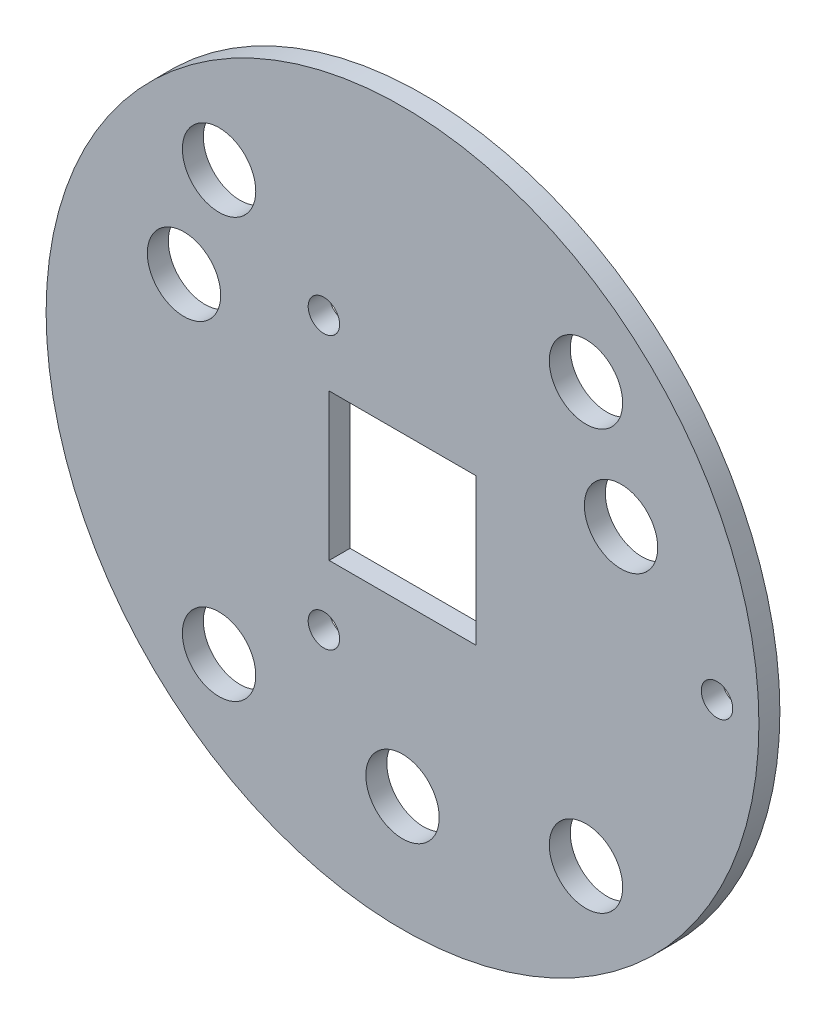
ISO-10303-21;
HEADER;
FILE_DESCRIPTION(('STEP AP214'),'2;1');
FILE_NAME('part.step','',(''),(''),'','','');
FILE_SCHEMA(('AUTOMOTIVE_DESIGN { 1 0 10303 214 1 1 1 1 }'));
ENDSEC;
DATA;
#1=APPLICATION_CONTEXT('core data for automotive mechanical design processes');
#2=APPLICATION_PROTOCOL_DEFINITION('international standard','automotive_design',2000,#1);
#3=PRODUCT_CONTEXT('',#1,'mechanical');
#4=PRODUCT('Part','Part','',(#3));
#5=PRODUCT_RELATED_PRODUCT_CATEGORY('part','',(#4));
#6=PRODUCT_DEFINITION_FORMATION('','',#4);
#7=PRODUCT_DEFINITION_CONTEXT('part definition',#1,'design');
#8=PRODUCT_DEFINITION('design','',#6,#7);
#9=PRODUCT_DEFINITION_SHAPE('','',#8);
#10=(LENGTH_UNIT() NAMED_UNIT(*) SI_UNIT(.MILLI.,.METRE.));
#11=(NAMED_UNIT(*) PLANE_ANGLE_UNIT() SI_UNIT($,.RADIAN.));
#12=(NAMED_UNIT(*) SI_UNIT($,.STERADIAN.) SOLID_ANGLE_UNIT());
#13=UNCERTAINTY_MEASURE_WITH_UNIT(LENGTH_MEASURE(1.E-05),#10,'distance_accuracy_value','');
#14=(GEOMETRIC_REPRESENTATION_CONTEXT(3) GLOBAL_UNCERTAINTY_ASSIGNED_CONTEXT((#13)) GLOBAL_UNIT_ASSIGNED_CONTEXT((#10,
#11,#12)) REPRESENTATION_CONTEXT('',''));
#15=CARTESIAN_POINT('',(0.,0.,0.));
#16=DIRECTION('',(0.,0.,1.));
#17=DIRECTION('',(1.,0.,0.));
#18=AXIS2_PLACEMENT_3D('',#15,#16,#17);
#19=CARTESIAN_POINT('',(0.,0.,2.));
#20=DIRECTION('',(0.,0.,1.));
#21=DIRECTION('',(1.,0.,0.));
#22=AXIS2_PLACEMENT_3D('',#19,#20,#21);
#23=PLANE('',#22);
#24=CARTESIAN_POINT('',(0.,-23.,2.));
#25=DIRECTION('',(0.,0.,1.));
#26=DIRECTION('',(1.,0.,0.));
#27=AXIS2_PLACEMENT_3D('',#24,#25,#26);
#28=CIRCLE('',#27,3.5);
#29=CARTESIAN_POINT('',(3.49999999999992,-23.,2.));
#30=VERTEX_POINT('',#29);
#31=EDGE_CURVE('E265',#30,#30,#28,.T.);
#32=ORIENTED_EDGE('',*,*,#31,.F.);
#33=EDGE_LOOP('',(#32));
#34=FACE_BOUND('',#33,.T.);
#35=CARTESIAN_POINT('',(17.5000000000001,-20.,2.));
#36=DIRECTION('',(0.,0.,1.));
#37=DIRECTION('',(1.,0.,0.));
#38=AXIS2_PLACEMENT_3D('',#35,#36,#37);
#39=CIRCLE('',#38,3.5);
#40=CARTESIAN_POINT('',(21.0000000000001,-20.,2.));
#41=VERTEX_POINT('',#40);
#42=EDGE_CURVE('E277',#41,#41,#39,.T.);
#43=ORIENTED_EDGE('',*,*,#42,.F.);
#44=EDGE_LOOP('',(#43));
#45=FACE_BOUND('',#44,.T.);
#46=CARTESIAN_POINT('',(17.5000000000001,20.,2.));
#47=DIRECTION('',(0.,0.,1.));
#48=DIRECTION('',(-1.,0.,0.));
#49=AXIS2_PLACEMENT_3D('',#46,#47,#48);
#50=CIRCLE('',#49,3.5);
#51=CARTESIAN_POINT('',(14.0000000000001,20.,2.));
#52=VERTEX_POINT('',#51);
#53=EDGE_CURVE('E289',#52,#52,#50,.T.);
#54=ORIENTED_EDGE('',*,*,#53,.F.);
#55=EDGE_LOOP('',(#54));
#56=FACE_BOUND('',#55,.T.);
#57=CARTESIAN_POINT('',(-7.50000000000001,12.9903810567666,2.));
#58=DIRECTION('',(0.,0.,1.));
#59=DIRECTION('',(1.,0.,0.));
#60=AXIS2_PLACEMENT_3D('',#57,#58,#59);
#61=CIRCLE('',#60,1.5);
#62=CARTESIAN_POINT('',(-6.00000000000001,12.9903810567666,2.));
#63=VERTEX_POINT('',#62);
#64=EDGE_CURVE('E301',#63,#63,#61,.T.);
#65=ORIENTED_EDGE('',*,*,#64,.F.);
#66=EDGE_LOOP('',(#65));
#67=FACE_BOUND('',#66,.T.);
#68=CARTESIAN_POINT('',(30.,0.,2.));
#69=DIRECTION('',(0.,0.,1.));
#70=DIRECTION('',(1.,0.,0.));
#71=AXIS2_PLACEMENT_3D('',#68,#69,#70);
#72=CIRCLE('',#71,1.5);
#73=CARTESIAN_POINT('',(31.5,0.,2.));
#74=VERTEX_POINT('',#73);
#75=EDGE_CURVE('E101',#74,#74,#72,.T.);
#76=ORIENTED_EDGE('',*,*,#75,.F.);
#77=EDGE_LOOP('',(#76));
#78=FACE_BOUND('',#77,.T.);
#79=CARTESIAN_POINT('',(0.,0.,2.));
#80=DIRECTION('',(0.,0.,1.));
#81=DIRECTION('',(1.,0.,0.));
#82=AXIS2_PLACEMENT_3D('',#79,#80,#81);
#83=CIRCLE('',#82,34.);
#84=CARTESIAN_POINT('',(34.,0.,2.));
#85=VERTEX_POINT('',#84);
#86=EDGE_CURVE('E11',#85,#85,#83,.T.);
#87=ORIENTED_EDGE('',*,*,#86,.T.);
#88=EDGE_LOOP('',(#87));
#89=FACE_BOUND('',#88,.T.);
#90=DIRECTION('',(1.,0.,0.));
#91=VECTOR('',#90,1.);
#92=CARTESIAN_POINT('',(-7.,-7.,2.));
#93=LINE('',#92,#91);
#94=CARTESIAN_POINT('',(-7.,-7.,2.));
#95=VERTEX_POINT('',#94);
#96=CARTESIAN_POINT('',(7.,-7.,2.));
#97=VERTEX_POINT('',#96);
#98=EDGE_CURVE('E81',#95,#97,#93,.T.);
#99=ORIENTED_EDGE('',*,*,#98,.F.);
#100=DIRECTION('',(0.,-1.,0.));
#101=VECTOR('',#100,1.);
#102=CARTESIAN_POINT('',(-7.,7.,2.));
#103=LINE('',#102,#101);
#104=CARTESIAN_POINT('',(-7.,7.,2.));
#105=VERTEX_POINT('',#104);
#106=EDGE_CURVE('E73',#105,#95,#103,.T.);
#107=ORIENTED_EDGE('',*,*,#106,.F.);
#108=DIRECTION('',(-1.,0.,0.));
#109=VECTOR('',#108,1.);
#110=CARTESIAN_POINT('',(-7.,7.,2.));
#111=LINE('',#110,#109);
#112=CARTESIAN_POINT('',(7.,7.,2.));
#113=VERTEX_POINT('',#112);
#114=EDGE_CURVE('E95',#113,#105,#111,.T.);
#115=ORIENTED_EDGE('',*,*,#114,.F.);
#116=DIRECTION('',(0.,1.,0.));
#117=VECTOR('',#116,1.);
#118=CARTESIAN_POINT('',(7.,7.,2.));
#119=LINE('',#118,#117);
#120=EDGE_CURVE('E93',#97,#113,#119,.T.);
#121=ORIENTED_EDGE('',*,*,#120,.F.);
#122=EDGE_LOOP('',(#99,#107,#115,#121));
#123=FACE_BOUND('',#122,.T.);
#124=CARTESIAN_POINT('',(-7.5,-12.9903810567666,2.));
#125=DIRECTION('',(0.,0.,1.));
#126=DIRECTION('',(1.,0.,0.));
#127=AXIS2_PLACEMENT_3D('',#124,#125,#126);
#128=CIRCLE('',#127,1.5);
#129=CARTESIAN_POINT('',(-5.99999999999999,-12.9903810567666,2.));
#130=VERTEX_POINT('',#129);
#131=EDGE_CURVE('E307',#130,#130,#128,.T.);
#132=ORIENTED_EDGE('',*,*,#131,.F.);
#133=EDGE_LOOP('',(#132));
#134=FACE_BOUND('',#133,.T.);
#135=CARTESIAN_POINT('',(-17.5000000000002,19.9999999999999,2.));
#136=DIRECTION('',(0.,0.,1.));
#137=DIRECTION('',(1.,0.,0.));
#138=AXIS2_PLACEMENT_3D('',#135,#136,#137);
#139=CIRCLE('',#138,3.5);
#140=CARTESIAN_POINT('',(-14.0000000000002,19.9999999999999,2.));
#141=VERTEX_POINT('',#140);
#142=EDGE_CURVE('E295',#141,#141,#139,.T.);
#143=ORIENTED_EDGE('',*,*,#142,.F.);
#144=EDGE_LOOP('',(#143));
#145=FACE_BOUND('',#144,.T.);
#146=CARTESIAN_POINT('',(-17.5000000000002,-19.9999999999999,2.));
#147=DIRECTION('',(0.,0.,1.));
#148=DIRECTION('',(-1.,0.,0.));
#149=AXIS2_PLACEMENT_3D('',#146,#147,#148);
#150=CIRCLE('',#149,3.5);
#151=CARTESIAN_POINT('',(-21.0000000000002,-19.9999999999999,2.));
#152=VERTEX_POINT('',#151);
#153=EDGE_CURVE('E283',#152,#152,#150,.T.);
#154=ORIENTED_EDGE('',*,*,#153,.F.);
#155=EDGE_LOOP('',(#154));
#156=FACE_BOUND('',#155,.T.);
#157=CARTESIAN_POINT('',(20.8450791018429,9.72022002003612,2.));
#158=DIRECTION('',(0.,0.,1.));
#159=DIRECTION('',(1.,0.,0.));
#160=AXIS2_PLACEMENT_3D('',#157,#158,#159);
#161=CIRCLE('',#160,3.5);
#162=CARTESIAN_POINT('',(24.3450791018429,9.72022002003612,2.));
#163=VERTEX_POINT('',#162);
#164=EDGE_CURVE('E271',#163,#163,#161,.T.);
#165=ORIENTED_EDGE('',*,*,#164,.F.);
#166=EDGE_LOOP('',(#165));
#167=FACE_BOUND('',#166,.T.);
#168=CARTESIAN_POINT('',(-20.8450791018429,9.72022002003625,2.));
#169=DIRECTION('',(0.,0.,1.));
#170=DIRECTION('',(1.,0.,0.));
#171=AXIS2_PLACEMENT_3D('',#168,#169,#170);
#172=CIRCLE('',#171,3.5);
#173=CARTESIAN_POINT('',(-17.3450791018429,9.72022002003625,2.));
#174=VERTEX_POINT('',#173);
#175=EDGE_CURVE('E256',#174,#174,#172,.T.);
#176=ORIENTED_EDGE('',*,*,#175,.F.);
#177=EDGE_LOOP('',(#176));
#178=FACE_BOUND('',#177,.T.);
#179=ADVANCED_FACE('F32',(#34,#45,#56,#67,#78,#89,#123,#134,#145,#156,#167,#178),#23,.T.);
#180=CARTESIAN_POINT('',(0.,0.,0.));
#181=DIRECTION('',(0.,0.,1.));
#182=DIRECTION('',(1.,0.,0.));
#183=AXIS2_PLACEMENT_3D('',#180,#181,#182);
#184=PLANE('',#183);
#185=CARTESIAN_POINT('',(0.,0.,0.));
#186=DIRECTION('',(0.,0.,1.));
#187=DIRECTION('',(1.,0.,0.));
#188=AXIS2_PLACEMENT_3D('',#185,#186,#187);
#189=CIRCLE('',#188,34.);
#190=CARTESIAN_POINT('',(34.,0.,0.));
#191=VERTEX_POINT('',#190);
#192=EDGE_CURVE('E36',#191,#191,#189,.T.);
#193=ORIENTED_EDGE('',*,*,#192,.F.);
#194=EDGE_LOOP('',(#193));
#195=FACE_BOUND('',#194,.T.);
#196=DIRECTION('',(0.,-1.,0.));
#197=VECTOR('',#196,1.);
#198=CARTESIAN_POINT('',(-7.,7.,0.));
#199=LINE('',#198,#197);
#200=CARTESIAN_POINT('',(-7.,7.,0.));
#201=VERTEX_POINT('',#200);
#202=CARTESIAN_POINT('',(-7.,-7.,0.));
#203=VERTEX_POINT('',#202);
#204=EDGE_CURVE('E55',#201,#203,#199,.T.);
#205=ORIENTED_EDGE('',*,*,#204,.T.);
#206=DIRECTION('',(1.,0.,0.));
#207=VECTOR('',#206,1.);
#208=CARTESIAN_POINT('',(-7.,-7.,0.));
#209=LINE('',#208,#207);
#210=CARTESIAN_POINT('',(7.,-7.,0.));
#211=VERTEX_POINT('',#210);
#212=EDGE_CURVE('E88',#203,#211,#209,.T.);
#213=ORIENTED_EDGE('',*,*,#212,.T.);
#214=DIRECTION('',(0.,1.,0.));
#215=VECTOR('',#214,1.);
#216=CARTESIAN_POINT('',(7.,7.,0.));
#217=LINE('',#216,#215);
#218=CARTESIAN_POINT('',(7.,7.,0.));
#219=VERTEX_POINT('',#218);
#220=EDGE_CURVE('E103',#211,#219,#217,.T.);
#221=ORIENTED_EDGE('',*,*,#220,.T.);
#222=DIRECTION('',(-1.,0.,0.));
#223=VECTOR('',#222,1.);
#224=CARTESIAN_POINT('',(-7.,7.,0.));
#225=LINE('',#224,#223);
#226=EDGE_CURVE('E82',#219,#201,#225,.T.);
#227=ORIENTED_EDGE('',*,*,#226,.T.);
#228=EDGE_LOOP('',(#205,#213,#221,#227));
#229=FACE_BOUND('',#228,.T.);
#230=CARTESIAN_POINT('',(30.,0.,0.));
#231=DIRECTION('',(0.,0.,1.));
#232=DIRECTION('',(1.,0.,0.));
#233=AXIS2_PLACEMENT_3D('',#230,#231,#232);
#234=CIRCLE('',#233,1.5);
#235=CARTESIAN_POINT('',(31.5,0.,0.));
#236=VERTEX_POINT('',#235);
#237=EDGE_CURVE('E310',#236,#236,#234,.T.);
#238=ORIENTED_EDGE('',*,*,#237,.T.);
#239=EDGE_LOOP('',(#238));
#240=FACE_BOUND('',#239,.T.);
#241=CARTESIAN_POINT('',(-7.5,-12.9903810567666,0.));
#242=DIRECTION('',(0.,0.,1.));
#243=DIRECTION('',(1.,0.,0.));
#244=AXIS2_PLACEMENT_3D('',#241,#242,#243);
#245=CIRCLE('',#244,1.5);
#246=CARTESIAN_POINT('',(-5.99999999999999,-12.9903810567666,0.));
#247=VERTEX_POINT('',#246);
#248=EDGE_CURVE('E304',#247,#247,#245,.T.);
#249=ORIENTED_EDGE('',*,*,#248,.T.);
#250=EDGE_LOOP('',(#249));
#251=FACE_BOUND('',#250,.T.);
#252=CARTESIAN_POINT('',(-7.50000000000001,12.9903810567666,0.));
#253=DIRECTION('',(0.,0.,1.));
#254=DIRECTION('',(1.,0.,0.));
#255=AXIS2_PLACEMENT_3D('',#252,#253,#254);
#256=CIRCLE('',#255,1.5);
#257=CARTESIAN_POINT('',(-6.00000000000001,12.9903810567666,0.));
#258=VERTEX_POINT('',#257);
#259=EDGE_CURVE('E298',#258,#258,#256,.T.);
#260=ORIENTED_EDGE('',*,*,#259,.T.);
#261=EDGE_LOOP('',(#260));
#262=FACE_BOUND('',#261,.T.);
#263=CARTESIAN_POINT('',(-17.5000000000002,19.9999999999999,0.));
#264=DIRECTION('',(0.,0.,1.));
#265=DIRECTION('',(1.,0.,0.));
#266=AXIS2_PLACEMENT_3D('',#263,#264,#265);
#267=CIRCLE('',#266,3.5);
#268=CARTESIAN_POINT('',(-14.0000000000002,19.9999999999999,0.));
#269=VERTEX_POINT('',#268);
#270=EDGE_CURVE('E292',#269,#269,#267,.T.);
#271=ORIENTED_EDGE('',*,*,#270,.T.);
#272=EDGE_LOOP('',(#271));
#273=FACE_BOUND('',#272,.T.);
#274=CARTESIAN_POINT('',(17.5000000000001,20.,0.));
#275=DIRECTION('',(0.,0.,1.));
#276=DIRECTION('',(-1.,0.,0.));
#277=AXIS2_PLACEMENT_3D('',#274,#275,#276);
#278=CIRCLE('',#277,3.5);
#279=CARTESIAN_POINT('',(14.0000000000001,20.,0.));
#280=VERTEX_POINT('',#279);
#281=EDGE_CURVE('E286',#280,#280,#278,.T.);
#282=ORIENTED_EDGE('',*,*,#281,.T.);
#283=EDGE_LOOP('',(#282));
#284=FACE_BOUND('',#283,.T.);
#285=CARTESIAN_POINT('',(-17.5000000000002,-19.9999999999999,0.));
#286=DIRECTION('',(0.,0.,1.));
#287=DIRECTION('',(-1.,0.,0.));
#288=AXIS2_PLACEMENT_3D('',#285,#286,#287);
#289=CIRCLE('',#288,3.5);
#290=CARTESIAN_POINT('',(-21.0000000000002,-19.9999999999999,0.));
#291=VERTEX_POINT('',#290);
#292=EDGE_CURVE('E280',#291,#291,#289,.T.);
#293=ORIENTED_EDGE('',*,*,#292,.T.);
#294=EDGE_LOOP('',(#293));
#295=FACE_BOUND('',#294,.T.);
#296=CARTESIAN_POINT('',(17.5000000000001,-20.,0.));
#297=DIRECTION('',(0.,0.,1.));
#298=DIRECTION('',(1.,0.,0.));
#299=AXIS2_PLACEMENT_3D('',#296,#297,#298);
#300=CIRCLE('',#299,3.5);
#301=CARTESIAN_POINT('',(21.0000000000001,-20.,0.));
#302=VERTEX_POINT('',#301);
#303=EDGE_CURVE('E274',#302,#302,#300,.T.);
#304=ORIENTED_EDGE('',*,*,#303,.T.);
#305=EDGE_LOOP('',(#304));
#306=FACE_BOUND('',#305,.T.);
#307=CARTESIAN_POINT('',(20.8450791018429,9.72022002003612,0.));
#308=DIRECTION('',(0.,0.,1.));
#309=DIRECTION('',(1.,0.,0.));
#310=AXIS2_PLACEMENT_3D('',#307,#308,#309);
#311=CIRCLE('',#310,3.5);
#312=CARTESIAN_POINT('',(24.3450791018429,9.72022002003612,0.));
#313=VERTEX_POINT('',#312);
#314=EDGE_CURVE('E268',#313,#313,#311,.T.);
#315=ORIENTED_EDGE('',*,*,#314,.T.);
#316=EDGE_LOOP('',(#315));
#317=FACE_BOUND('',#316,.T.);
#318=CARTESIAN_POINT('',(0.,-23.,0.));
#319=DIRECTION('',(0.,0.,1.));
#320=DIRECTION('',(1.,0.,0.));
#321=AXIS2_PLACEMENT_3D('',#318,#319,#320);
#322=CIRCLE('',#321,3.5);
#323=CARTESIAN_POINT('',(3.49999999999992,-23.,0.));
#324=VERTEX_POINT('',#323);
#325=EDGE_CURVE('E262',#324,#324,#322,.T.);
#326=ORIENTED_EDGE('',*,*,#325,.T.);
#327=EDGE_LOOP('',(#326));
#328=FACE_BOUND('',#327,.T.);
#329=CARTESIAN_POINT('',(-20.8450791018429,9.72022002003625,0.));
#330=DIRECTION('',(0.,0.,1.));
#331=DIRECTION('',(1.,0.,0.));
#332=AXIS2_PLACEMENT_3D('',#329,#330,#331);
#333=CIRCLE('',#332,3.5);
#334=CARTESIAN_POINT('',(-17.3450791018429,9.72022002003625,0.));
#335=VERTEX_POINT('',#334);
#336=EDGE_CURVE('E259',#335,#335,#333,.T.);
#337=ORIENTED_EDGE('',*,*,#336,.T.);
#338=EDGE_LOOP('',(#337));
#339=FACE_BOUND('',#338,.T.);
#340=ADVANCED_FACE('F114',(#195,#229,#240,#251,#262,#273,#284,#295,#306,#317,#328,#339),#184,.F.);
#341=CARTESIAN_POINT('',(0.,0.,2.));
#342=DIRECTION('',(0.,0.,-1.));
#343=DIRECTION('',(-1.,0.,0.));
#344=AXIS2_PLACEMENT_3D('',#341,#342,#343);
#345=CYLINDRICAL_SURFACE('',#344,34.);
#346=ORIENTED_EDGE('',*,*,#86,.F.);
#347=EDGE_LOOP('',(#346));
#348=FACE_BOUND('',#347,.T.);
#349=ORIENTED_EDGE('',*,*,#192,.T.);
#350=EDGE_LOOP('',(#349));
#351=FACE_BOUND('',#350,.T.);
#352=ADVANCED_FACE('F34',(#348,#351),#345,.T.);
#353=CARTESIAN_POINT('',(-7.,7.,2.));
#354=DIRECTION('',(1.,0.,0.));
#355=DIRECTION('',(0.,0.,-1.));
#356=AXIS2_PLACEMENT_3D('',#353,#354,#355);
#357=PLANE('',#356);
#358=ORIENTED_EDGE('',*,*,#204,.F.);
#359=DIRECTION('',(0.,0.,-1.));
#360=VECTOR('',#359,1.);
#361=CARTESIAN_POINT('',(-7.,7.,2.));
#362=LINE('',#361,#360);
#363=EDGE_CURVE('E77',#105,#201,#362,.T.);
#364=ORIENTED_EDGE('',*,*,#363,.F.);
#365=ORIENTED_EDGE('',*,*,#106,.T.);
#366=DIRECTION('',(0.,0.,-1.));
#367=VECTOR('',#366,1.);
#368=CARTESIAN_POINT('',(-7.,-7.,2.));
#369=LINE('',#368,#367);
#370=EDGE_CURVE('E76',#95,#203,#369,.T.);
#371=ORIENTED_EDGE('',*,*,#370,.T.);
#372=EDGE_LOOP('',(#358,#364,#365,#371));
#373=FACE_BOUND('',#372,.T.);
#374=ADVANCED_FACE('F75',(#373),#357,.T.);
#375=CARTESIAN_POINT('',(-7.,-7.,2.));
#376=DIRECTION('',(0.,1.,0.));
#377=DIRECTION('',(0.,0.,1.));
#378=AXIS2_PLACEMENT_3D('',#375,#376,#377);
#379=PLANE('',#378);
#380=ORIENTED_EDGE('',*,*,#212,.F.);
#381=ORIENTED_EDGE('',*,*,#370,.F.);
#382=ORIENTED_EDGE('',*,*,#98,.T.);
#383=DIRECTION('',(0.,0.,-1.));
#384=VECTOR('',#383,1.);
#385=CARTESIAN_POINT('',(7.,-7.,2.));
#386=LINE('',#385,#384);
#387=EDGE_CURVE('E89',#97,#211,#386,.T.);
#388=ORIENTED_EDGE('',*,*,#387,.T.);
#389=EDGE_LOOP('',(#380,#381,#382,#388));
#390=FACE_BOUND('',#389,.T.);
#391=ADVANCED_FACE('F85',(#390),#379,.T.);
#392=CARTESIAN_POINT('',(7.,7.,2.));
#393=DIRECTION('',(-1.,0.,0.));
#394=DIRECTION('',(0.,0.,1.));
#395=AXIS2_PLACEMENT_3D('',#392,#393,#394);
#396=PLANE('',#395);
#397=ORIENTED_EDGE('',*,*,#220,.F.);
#398=ORIENTED_EDGE('',*,*,#387,.F.);
#399=ORIENTED_EDGE('',*,*,#120,.T.);
#400=DIRECTION('',(0.,0.,-1.));
#401=VECTOR('',#400,1.);
#402=CARTESIAN_POINT('',(7.,7.,2.));
#403=LINE('',#402,#401);
#404=EDGE_CURVE('E47',#113,#219,#403,.T.);
#405=ORIENTED_EDGE('',*,*,#404,.T.);
#406=EDGE_LOOP('',(#397,#398,#399,#405));
#407=FACE_BOUND('',#406,.T.);
#408=ADVANCED_FACE('F112',(#407),#396,.T.);
#409=CARTESIAN_POINT('',(-7.,7.,2.));
#410=DIRECTION('',(0.,-1.,0.));
#411=DIRECTION('',(1.,0.,0.));
#412=AXIS2_PLACEMENT_3D('',#409,#410,#411);
#413=PLANE('',#412);
#414=ORIENTED_EDGE('',*,*,#226,.F.);
#415=ORIENTED_EDGE('',*,*,#404,.F.);
#416=ORIENTED_EDGE('',*,*,#114,.T.);
#417=ORIENTED_EDGE('',*,*,#363,.T.);
#418=EDGE_LOOP('',(#414,#415,#416,#417));
#419=FACE_BOUND('',#418,.T.);
#420=ADVANCED_FACE('F116',(#419),#413,.T.);
#421=CARTESIAN_POINT('',(30.,0.,2.));
#422=DIRECTION('',(0.,0.,-1.));
#423=DIRECTION('',(-1.,0.,0.));
#424=AXIS2_PLACEMENT_3D('',#421,#422,#423);
#425=CYLINDRICAL_SURFACE('',#424,1.5);
#426=ORIENTED_EDGE('',*,*,#75,.T.);
#427=EDGE_LOOP('',(#426));
#428=FACE_BOUND('',#427,.T.);
#429=ORIENTED_EDGE('',*,*,#237,.F.);
#430=EDGE_LOOP('',(#429));
#431=FACE_BOUND('',#430,.T.);
#432=ADVANCED_FACE('F118',(#428,#431),#425,.F.);
#433=CARTESIAN_POINT('',(-7.5,-12.9903810567666,2.));
#434=DIRECTION('',(0.,0.,-1.));
#435=DIRECTION('',(-1.,0.,0.));
#436=AXIS2_PLACEMENT_3D('',#433,#434,#435);
#437=CYLINDRICAL_SURFACE('',#436,1.5);
#438=ORIENTED_EDGE('',*,*,#131,.T.);
#439=EDGE_LOOP('',(#438));
#440=FACE_BOUND('',#439,.T.);
#441=ORIENTED_EDGE('',*,*,#248,.F.);
#442=EDGE_LOOP('',(#441));
#443=FACE_BOUND('',#442,.T.);
#444=ADVANCED_FACE('F124',(#440,#443),#437,.F.);
#445=CARTESIAN_POINT('',(-7.50000000000001,12.9903810567666,2.));
#446=DIRECTION('',(0.,0.,-1.));
#447=DIRECTION('',(-1.,0.,0.));
#448=AXIS2_PLACEMENT_3D('',#445,#446,#447);
#449=CYLINDRICAL_SURFACE('',#448,1.5);
#450=ORIENTED_EDGE('',*,*,#64,.T.);
#451=EDGE_LOOP('',(#450));
#452=FACE_BOUND('',#451,.T.);
#453=ORIENTED_EDGE('',*,*,#259,.F.);
#454=EDGE_LOOP('',(#453));
#455=FACE_BOUND('',#454,.T.);
#456=ADVANCED_FACE('F169',(#452,#455),#449,.F.);
#457=CARTESIAN_POINT('',(-17.5000000000002,19.9999999999999,2.));
#458=DIRECTION('',(0.,0.,-1.));
#459=DIRECTION('',(-1.,0.,0.));
#460=AXIS2_PLACEMENT_3D('',#457,#458,#459);
#461=CYLINDRICAL_SURFACE('',#460,3.5);
#462=ORIENTED_EDGE('',*,*,#142,.T.);
#463=EDGE_LOOP('',(#462));
#464=FACE_BOUND('',#463,.T.);
#465=ORIENTED_EDGE('',*,*,#270,.F.);
#466=EDGE_LOOP('',(#465));
#467=FACE_BOUND('',#466,.T.);
#468=ADVANCED_FACE('F179',(#464,#467),#461,.F.);
#469=CARTESIAN_POINT('',(17.5000000000001,20.,2.));
#470=DIRECTION('',(0.,0.,-1.));
#471=DIRECTION('',(-1.,0.,0.));
#472=AXIS2_PLACEMENT_3D('',#469,#470,#471);
#473=CYLINDRICAL_SURFACE('',#472,3.5);
#474=ORIENTED_EDGE('',*,*,#53,.T.);
#475=EDGE_LOOP('',(#474));
#476=FACE_BOUND('',#475,.T.);
#477=ORIENTED_EDGE('',*,*,#281,.F.);
#478=EDGE_LOOP('',(#477));
#479=FACE_BOUND('',#478,.T.);
#480=ADVANCED_FACE('F189',(#476,#479),#473,.F.);
#481=CARTESIAN_POINT('',(-17.5000000000002,-19.9999999999999,2.));
#482=DIRECTION('',(0.,0.,-1.));
#483=DIRECTION('',(-1.,0.,0.));
#484=AXIS2_PLACEMENT_3D('',#481,#482,#483);
#485=CYLINDRICAL_SURFACE('',#484,3.5);
#486=ORIENTED_EDGE('',*,*,#153,.T.);
#487=EDGE_LOOP('',(#486));
#488=FACE_BOUND('',#487,.T.);
#489=ORIENTED_EDGE('',*,*,#292,.F.);
#490=EDGE_LOOP('',(#489));
#491=FACE_BOUND('',#490,.T.);
#492=ADVANCED_FACE('F199',(#488,#491),#485,.F.);
#493=CARTESIAN_POINT('',(17.5000000000001,-20.,2.));
#494=DIRECTION('',(0.,0.,-1.));
#495=DIRECTION('',(-1.,0.,0.));
#496=AXIS2_PLACEMENT_3D('',#493,#494,#495);
#497=CYLINDRICAL_SURFACE('',#496,3.5);
#498=ORIENTED_EDGE('',*,*,#42,.T.);
#499=EDGE_LOOP('',(#498));
#500=FACE_BOUND('',#499,.T.);
#501=ORIENTED_EDGE('',*,*,#303,.F.);
#502=EDGE_LOOP('',(#501));
#503=FACE_BOUND('',#502,.T.);
#504=ADVANCED_FACE('F209',(#500,#503),#497,.F.);
#505=CARTESIAN_POINT('',(20.8450791018429,9.72022002003612,2.));
#506=DIRECTION('',(0.,0.,-1.));
#507=DIRECTION('',(-1.,0.,0.));
#508=AXIS2_PLACEMENT_3D('',#505,#506,#507);
#509=CYLINDRICAL_SURFACE('',#508,3.5);
#510=ORIENTED_EDGE('',*,*,#164,.T.);
#511=EDGE_LOOP('',(#510));
#512=FACE_BOUND('',#511,.T.);
#513=ORIENTED_EDGE('',*,*,#314,.F.);
#514=EDGE_LOOP('',(#513));
#515=FACE_BOUND('',#514,.T.);
#516=ADVANCED_FACE('F219',(#512,#515),#509,.F.);
#517=CARTESIAN_POINT('',(0.,-23.,2.));
#518=DIRECTION('',(0.,0.,-1.));
#519=DIRECTION('',(-1.,0.,0.));
#520=AXIS2_PLACEMENT_3D('',#517,#518,#519);
#521=CYLINDRICAL_SURFACE('',#520,3.5);
#522=ORIENTED_EDGE('',*,*,#31,.T.);
#523=EDGE_LOOP('',(#522));
#524=FACE_BOUND('',#523,.T.);
#525=ORIENTED_EDGE('',*,*,#325,.F.);
#526=EDGE_LOOP('',(#525));
#527=FACE_BOUND('',#526,.T.);
#528=ADVANCED_FACE('F229',(#524,#527),#521,.F.);
#529=CARTESIAN_POINT('',(-20.8450791018429,9.72022002003625,2.));
#530=DIRECTION('',(0.,0.,-1.));
#531=DIRECTION('',(-1.,0.,0.));
#532=AXIS2_PLACEMENT_3D('',#529,#530,#531);
#533=CYLINDRICAL_SURFACE('',#532,3.5);
#534=ORIENTED_EDGE('',*,*,#175,.T.);
#535=EDGE_LOOP('',(#534));
#536=FACE_BOUND('',#535,.T.);
#537=ORIENTED_EDGE('',*,*,#336,.F.);
#538=EDGE_LOOP('',(#537));
#539=FACE_BOUND('',#538,.T.);
#540=ADVANCED_FACE('F239',(#536,#539),#533,.F.);
#541=CLOSED_SHELL('',(#179,#340,#352,#374,#391,#408,#420,#432,#444,#456,#468,#480,#492,#504,
#516,#528,#540));
#542=MANIFOLD_SOLID_BREP('B2',#541);
#543=ADVANCED_BREP_SHAPE_REPRESENTATION('',(#18,#542),#14);
#544=SHAPE_DEFINITION_REPRESENTATION(#9,#543);
ENDSEC;
END-ISO-10303-21;
